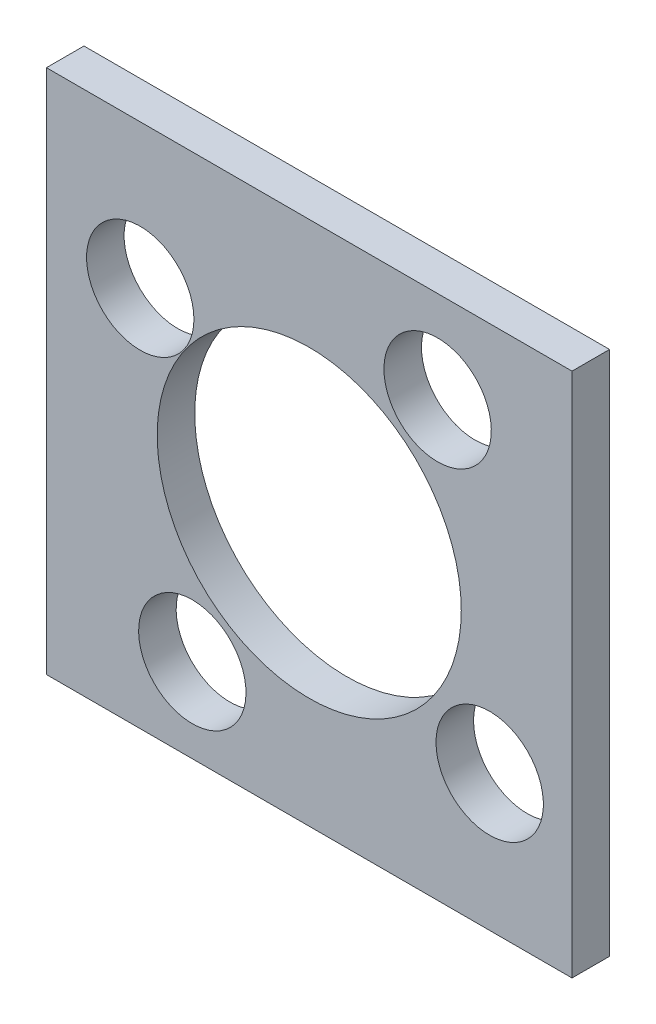
ISO-10303-21;
HEADER;
FILE_DESCRIPTION(('STEP AP214'),'2;1');
FILE_NAME('part.step','',(''),(''),'','','');
FILE_SCHEMA(('AUTOMOTIVE_DESIGN { 1 0 10303 214 1 1 1 1 }'));
ENDSEC;
DATA;
#1=APPLICATION_CONTEXT('core data for automotive mechanical design processes');
#2=APPLICATION_PROTOCOL_DEFINITION('international standard','automotive_design',2000,#1);
#3=PRODUCT_CONTEXT('',#1,'mechanical');
#4=PRODUCT('Part','Part','',(#3));
#5=PRODUCT_RELATED_PRODUCT_CATEGORY('part','',(#4));
#6=PRODUCT_DEFINITION_FORMATION('','',#4);
#7=PRODUCT_DEFINITION_CONTEXT('part definition',#1,'design');
#8=PRODUCT_DEFINITION('design','',#6,#7);
#9=PRODUCT_DEFINITION_SHAPE('','',#8);
#10=(LENGTH_UNIT() NAMED_UNIT(*) SI_UNIT(.MILLI.,.METRE.));
#11=(NAMED_UNIT(*) PLANE_ANGLE_UNIT() SI_UNIT($,.RADIAN.));
#12=(NAMED_UNIT(*) SI_UNIT($,.STERADIAN.) SOLID_ANGLE_UNIT());
#13=UNCERTAINTY_MEASURE_WITH_UNIT(LENGTH_MEASURE(1.E-05),#10,'distance_accuracy_value','');
#14=(GEOMETRIC_REPRESENTATION_CONTEXT(3) GLOBAL_UNCERTAINTY_ASSIGNED_CONTEXT((#13)) GLOBAL_UNIT_ASSIGNED_CONTEXT((#10,
#11,#12)) REPRESENTATION_CONTEXT('',''));
#15=CARTESIAN_POINT('',(0.,0.,0.));
#16=DIRECTION('',(0.,0.,1.));
#17=DIRECTION('',(1.,0.,0.));
#18=AXIS2_PLACEMENT_3D('',#15,#16,#17);
#19=CARTESIAN_POINT('',(70.,70.,10.));
#20=DIRECTION('',(-1.,0.,0.));
#21=DIRECTION('',(0.,-1.,0.));
#22=AXIS2_PLACEMENT_3D('',#19,#20,#21);
#23=PLANE('',#22);
#24=DIRECTION('',(0.,1.,0.));
#25=VECTOR('',#24,1.);
#26=CARTESIAN_POINT('',(70.,70.,0.));
#27=LINE('',#26,#25);
#28=CARTESIAN_POINT('',(70.,-70.,0.));
#29=VERTEX_POINT('',#28);
#30=CARTESIAN_POINT('',(70.,70.,0.));
#31=VERTEX_POINT('',#30);
#32=EDGE_CURVE('E113',#29,#31,#27,.T.);
#33=ORIENTED_EDGE('',*,*,#32,.T.);
#34=DIRECTION('',(0.,0.,-1.));
#35=VECTOR('',#34,1.);
#36=CARTESIAN_POINT('',(70.,70.,10.));
#37=LINE('',#36,#35);
#38=CARTESIAN_POINT('',(70.,70.,10.));
#39=VERTEX_POINT('',#38);
#40=EDGE_CURVE('E11',#39,#31,#37,.T.);
#41=ORIENTED_EDGE('',*,*,#40,.F.);
#42=DIRECTION('',(0.,1.,0.));
#43=VECTOR('',#42,1.);
#44=CARTESIAN_POINT('',(70.,70.,10.));
#45=LINE('',#44,#43);
#46=CARTESIAN_POINT('',(70.,-70.,10.));
#47=VERTEX_POINT('',#46);
#48=EDGE_CURVE('E97',#47,#39,#45,.T.);
#49=ORIENTED_EDGE('',*,*,#48,.F.);
#50=DIRECTION('',(0.,0.,-1.));
#51=VECTOR('',#50,1.);
#52=CARTESIAN_POINT('',(70.,-70.,10.));
#53=LINE('',#52,#51);
#54=EDGE_CURVE('E109',#47,#29,#53,.T.);
#55=ORIENTED_EDGE('',*,*,#54,.T.);
#56=EDGE_LOOP('',(#33,#41,#49,#55));
#57=FACE_BOUND('',#56,.T.);
#58=ADVANCED_FACE('F45',(#57),#23,.F.);
#59=CARTESIAN_POINT('',(-70.,70.,10.));
#60=DIRECTION('',(0.,-1.,0.));
#61=DIRECTION('',(0.,0.,-1.));
#62=AXIS2_PLACEMENT_3D('',#59,#60,#61);
#63=PLANE('',#62);
#64=DIRECTION('',(-1.,0.,0.));
#65=VECTOR('',#64,1.);
#66=CARTESIAN_POINT('',(-70.,70.,0.));
#67=LINE('',#66,#65);
#68=CARTESIAN_POINT('',(-70.,70.,0.));
#69=VERTEX_POINT('',#68);
#70=EDGE_CURVE('E102',#31,#69,#67,.T.);
#71=ORIENTED_EDGE('',*,*,#70,.T.);
#72=DIRECTION('',(0.,0.,-1.));
#73=VECTOR('',#72,1.);
#74=CARTESIAN_POINT('',(-70.,70.,10.));
#75=LINE('',#74,#73);
#76=CARTESIAN_POINT('',(-70.,70.,10.));
#77=VERTEX_POINT('',#76);
#78=EDGE_CURVE('E54',#77,#69,#75,.T.);
#79=ORIENTED_EDGE('',*,*,#78,.F.);
#80=DIRECTION('',(-1.,0.,0.));
#81=VECTOR('',#80,1.);
#82=CARTESIAN_POINT('',(-70.,70.,10.));
#83=LINE('',#82,#81);
#84=EDGE_CURVE('E92',#39,#77,#83,.T.);
#85=ORIENTED_EDGE('',*,*,#84,.F.);
#86=ORIENTED_EDGE('',*,*,#40,.T.);
#87=EDGE_LOOP('',(#71,#79,#85,#86));
#88=FACE_BOUND('',#87,.T.);
#89=ADVANCED_FACE('F101',(#88),#63,.F.);
#90=CARTESIAN_POINT('',(-70.,70.,10.));
#91=DIRECTION('',(1.,0.,0.));
#92=DIRECTION('',(0.,1.,0.));
#93=AXIS2_PLACEMENT_3D('',#90,#91,#92);
#94=PLANE('',#93);
#95=DIRECTION('',(0.,-1.,0.));
#96=VECTOR('',#95,1.);
#97=CARTESIAN_POINT('',(-70.,70.,0.));
#98=LINE('',#97,#96);
#99=CARTESIAN_POINT('',(-70.,-70.,0.));
#100=VERTEX_POINT('',#99);
#101=EDGE_CURVE('E79',#69,#100,#98,.T.);
#102=ORIENTED_EDGE('',*,*,#101,.T.);
#103=DIRECTION('',(0.,0.,-1.));
#104=VECTOR('',#103,1.);
#105=CARTESIAN_POINT('',(-70.,-70.,10.));
#106=LINE('',#105,#104);
#107=CARTESIAN_POINT('',(-70.,-70.,10.));
#108=VERTEX_POINT('',#107);
#109=EDGE_CURVE('E104',#108,#100,#106,.T.);
#110=ORIENTED_EDGE('',*,*,#109,.F.);
#111=DIRECTION('',(0.,-1.,0.));
#112=VECTOR('',#111,1.);
#113=CARTESIAN_POINT('',(-70.,70.,10.));
#114=LINE('',#113,#112);
#115=EDGE_CURVE('E95',#77,#108,#114,.T.);
#116=ORIENTED_EDGE('',*,*,#115,.F.);
#117=ORIENTED_EDGE('',*,*,#78,.T.);
#118=EDGE_LOOP('',(#102,#110,#116,#117));
#119=FACE_BOUND('',#118,.T.);
#120=ADVANCED_FACE('F105',(#119),#94,.F.);
#121=CARTESIAN_POINT('',(-70.,-70.,10.));
#122=DIRECTION('',(0.,1.,0.));
#123=DIRECTION('',(0.,0.,1.));
#124=AXIS2_PLACEMENT_3D('',#121,#122,#123);
#125=PLANE('',#124);
#126=DIRECTION('',(1.,0.,0.));
#127=VECTOR('',#126,1.);
#128=CARTESIAN_POINT('',(-70.,-70.,0.));
#129=LINE('',#128,#127);
#130=EDGE_CURVE('E85',#100,#29,#129,.T.);
#131=ORIENTED_EDGE('',*,*,#130,.T.);
#132=ORIENTED_EDGE('',*,*,#54,.F.);
#133=DIRECTION('',(1.,0.,0.));
#134=VECTOR('',#133,1.);
#135=CARTESIAN_POINT('',(-70.,-70.,10.));
#136=LINE('',#135,#134);
#137=EDGE_CURVE('E62',#108,#47,#136,.T.);
#138=ORIENTED_EDGE('',*,*,#137,.F.);
#139=ORIENTED_EDGE('',*,*,#109,.T.);
#140=EDGE_LOOP('',(#131,#132,#138,#139));
#141=FACE_BOUND('',#140,.T.);
#142=ADVANCED_FACE('F127',(#141),#125,.F.);
#143=CARTESIAN_POINT('',(0.,0.,10.));
#144=DIRECTION('',(0.,0.,1.));
#145=DIRECTION('',(1.,0.,0.));
#146=AXIS2_PLACEMENT_3D('',#143,#144,#145);
#147=PLANE('',#146);
#148=CARTESIAN_POINT('',(0.,0.,10.));
#149=DIRECTION('',(0.,0.,1.));
#150=DIRECTION('',(1.,0.,0.));
#151=AXIS2_PLACEMENT_3D('',#148,#149,#150);
#152=CIRCLE('',#151,40.5);
#153=CARTESIAN_POINT('',(40.5,0.,10.));
#154=VERTEX_POINT('',#153);
#155=EDGE_CURVE('E166',#154,#154,#152,.T.);
#156=ORIENTED_EDGE('',*,*,#155,.F.);
#157=EDGE_LOOP('',(#156));
#158=FACE_BOUND('',#157,.T.);
#159=CARTESIAN_POINT('',(-31.14529457582,-47.6123660636759,10.));
#160=DIRECTION('',(0.,0.,1.));
#161=DIRECTION('',(0.,1.,0.));
#162=AXIS2_PLACEMENT_3D('',#159,#160,#161);
#163=CIRCLE('',#162,14.3);
#164=CARTESIAN_POINT('',(-31.1452945758201,-33.3123660636759,10.));
#165=VERTEX_POINT('',#164);
#166=EDGE_CURVE('E159',#165,#165,#163,.T.);
#167=ORIENTED_EDGE('',*,*,#166,.F.);
#168=EDGE_LOOP('',(#167));
#169=FACE_BOUND('',#168,.T.);
#170=CARTESIAN_POINT('',(48.0670041508742,-33.7416162142836,10.));
#171=DIRECTION('',(0.,0.,1.));
#172=DIRECTION('',(-1.,0.,0.));
#173=AXIS2_PLACEMENT_3D('',#170,#171,#172);
#174=CIRCLE('',#173,14.3);
#175=CARTESIAN_POINT('',(33.7670041508742,-33.7416162142836,10.));
#176=VERTEX_POINT('',#175);
#177=EDGE_CURVE('E151',#176,#176,#174,.T.);
#178=ORIENTED_EDGE('',*,*,#177,.F.);
#179=EDGE_LOOP('',(#178));
#180=FACE_BOUND('',#179,.T.);
#181=CARTESIAN_POINT('',(34.1962543014815,45.4706825124111,10.));
#182=DIRECTION('',(0.,0.,1.));
#183=DIRECTION('',(0.,-1.,0.));
#184=AXIS2_PLACEMENT_3D('',#181,#182,#183);
#185=CIRCLE('',#184,14.3);
#186=CARTESIAN_POINT('',(34.1962543014817,31.1706825124111,10.));
#187=VERTEX_POINT('',#186);
#188=EDGE_CURVE('E142',#187,#187,#185,.T.);
#189=ORIENTED_EDGE('',*,*,#188,.F.);
#190=EDGE_LOOP('',(#189));
#191=FACE_BOUND('',#190,.T.);
#192=CARTESIAN_POINT('',(-45.0160444252124,31.5999326630186,10.));
#193=DIRECTION('',(0.,0.,1.));
#194=DIRECTION('',(1.,0.,0.));
#195=AXIS2_PLACEMENT_3D('',#192,#193,#194);
#196=CIRCLE('',#195,14.3);
#197=CARTESIAN_POINT('',(-30.7160444252124,31.5999326630186,10.));
#198=VERTEX_POINT('',#197);
#199=EDGE_CURVE('E134',#198,#198,#196,.T.);
#200=ORIENTED_EDGE('',*,*,#199,.F.);
#201=EDGE_LOOP('',(#200));
#202=FACE_BOUND('',#201,.T.);
#203=ORIENTED_EDGE('',*,*,#48,.T.);
#204=ORIENTED_EDGE('',*,*,#84,.T.);
#205=ORIENTED_EDGE('',*,*,#115,.T.);
#206=ORIENTED_EDGE('',*,*,#137,.T.);
#207=EDGE_LOOP('',(#203,#204,#205,#206));
#208=FACE_BOUND('',#207,.T.);
#209=ADVANCED_FACE('F93',(#158,#169,#180,#191,#202,#208),#147,.T.);
#210=CARTESIAN_POINT('',(0.,0.,0.));
#211=DIRECTION('',(0.,0.,1.));
#212=DIRECTION('',(1.,0.,0.));
#213=AXIS2_PLACEMENT_3D('',#210,#211,#212);
#214=PLANE('',#213);
#215=CARTESIAN_POINT('',(0.,0.,0.));
#216=DIRECTION('',(0.,0.,1.));
#217=DIRECTION('',(1.,0.,0.));
#218=AXIS2_PLACEMENT_3D('',#215,#216,#217);
#219=CIRCLE('',#218,40.5);
#220=CARTESIAN_POINT('',(40.5,0.,0.));
#221=VERTEX_POINT('',#220);
#222=EDGE_CURVE('E147',#221,#221,#219,.T.);
#223=ORIENTED_EDGE('',*,*,#222,.T.);
#224=EDGE_LOOP('',(#223));
#225=FACE_BOUND('',#224,.T.);
#226=CARTESIAN_POINT('',(-31.14529457582,-47.6123660636759,0.));
#227=DIRECTION('',(0.,0.,1.));
#228=DIRECTION('',(0.,1.,0.));
#229=AXIS2_PLACEMENT_3D('',#226,#227,#228);
#230=CIRCLE('',#229,14.3);
#231=CARTESIAN_POINT('',(-31.1452945758201,-33.3123660636759,0.));
#232=VERTEX_POINT('',#231);
#233=EDGE_CURVE('E138',#232,#232,#230,.T.);
#234=ORIENTED_EDGE('',*,*,#233,.T.);
#235=EDGE_LOOP('',(#234));
#236=FACE_BOUND('',#235,.T.);
#237=CARTESIAN_POINT('',(48.0670041508742,-33.7416162142836,0.));
#238=DIRECTION('',(0.,0.,1.));
#239=DIRECTION('',(-1.,0.,0.));
#240=AXIS2_PLACEMENT_3D('',#237,#238,#239);
#241=CIRCLE('',#240,14.3);
#242=CARTESIAN_POINT('',(33.7670041508742,-33.7416162142836,0.));
#243=VERTEX_POINT('',#242);
#244=EDGE_CURVE('E155',#243,#243,#241,.T.);
#245=ORIENTED_EDGE('',*,*,#244,.T.);
#246=EDGE_LOOP('',(#245));
#247=FACE_BOUND('',#246,.T.);
#248=CARTESIAN_POINT('',(34.1962543014815,45.4706825124111,0.));
#249=DIRECTION('',(0.,0.,1.));
#250=DIRECTION('',(0.,-1.,0.));
#251=AXIS2_PLACEMENT_3D('',#248,#249,#250);
#252=CIRCLE('',#251,14.3);
#253=CARTESIAN_POINT('',(34.1962543014817,31.1706825124111,0.));
#254=VERTEX_POINT('',#253);
#255=EDGE_CURVE('E146',#254,#254,#252,.T.);
#256=ORIENTED_EDGE('',*,*,#255,.T.);
#257=EDGE_LOOP('',(#256));
#258=FACE_BOUND('',#257,.T.);
#259=CARTESIAN_POINT('',(-45.0160444252124,31.5999326630186,0.));
#260=DIRECTION('',(0.,0.,1.));
#261=DIRECTION('',(1.,0.,0.));
#262=AXIS2_PLACEMENT_3D('',#259,#260,#261);
#263=CIRCLE('',#262,14.3);
#264=CARTESIAN_POINT('',(-30.7160444252124,31.5999326630186,0.));
#265=VERTEX_POINT('',#264);
#266=EDGE_CURVE('E117',#265,#265,#263,.T.);
#267=ORIENTED_EDGE('',*,*,#266,.T.);
#268=EDGE_LOOP('',(#267));
#269=FACE_BOUND('',#268,.T.);
#270=ORIENTED_EDGE('',*,*,#32,.F.);
#271=ORIENTED_EDGE('',*,*,#130,.F.);
#272=ORIENTED_EDGE('',*,*,#101,.F.);
#273=ORIENTED_EDGE('',*,*,#70,.F.);
#274=EDGE_LOOP('',(#270,#271,#272,#273));
#275=FACE_BOUND('',#274,.T.);
#276=ADVANCED_FACE('F130',(#225,#236,#247,#258,#269,#275),#214,.F.);
#277=CARTESIAN_POINT('',(-45.0160444252124,31.5999326630186,0.));
#278=DIRECTION('',(0.,0.,1.));
#279=DIRECTION('',(1.,0.,0.));
#280=AXIS2_PLACEMENT_3D('',#277,#278,#279);
#281=CYLINDRICAL_SURFACE('',#280,14.3);
#282=ORIENTED_EDGE('',*,*,#266,.F.);
#283=EDGE_LOOP('',(#282));
#284=FACE_BOUND('',#283,.T.);
#285=ORIENTED_EDGE('',*,*,#199,.T.);
#286=EDGE_LOOP('',(#285));
#287=FACE_BOUND('',#286,.T.);
#288=ADVANCED_FACE('F194',(#284,#287),#281,.F.);
#289=CARTESIAN_POINT('',(34.1962543014815,45.4706825124111,0.));
#290=DIRECTION('',(0.,0.,1.));
#291=DIRECTION('',(1.,0.,0.));
#292=AXIS2_PLACEMENT_3D('',#289,#290,#291);
#293=CYLINDRICAL_SURFACE('',#292,14.3);
#294=ORIENTED_EDGE('',*,*,#255,.F.);
#295=EDGE_LOOP('',(#294));
#296=FACE_BOUND('',#295,.T.);
#297=ORIENTED_EDGE('',*,*,#188,.T.);
#298=EDGE_LOOP('',(#297));
#299=FACE_BOUND('',#298,.T.);
#300=ADVANCED_FACE('F196',(#296,#299),#293,.F.);
#301=CARTESIAN_POINT('',(48.0670041508742,-33.7416162142836,0.));
#302=DIRECTION('',(0.,0.,1.));
#303=DIRECTION('',(1.,0.,0.));
#304=AXIS2_PLACEMENT_3D('',#301,#302,#303);
#305=CYLINDRICAL_SURFACE('',#304,14.3);
#306=ORIENTED_EDGE('',*,*,#244,.F.);
#307=EDGE_LOOP('',(#306));
#308=FACE_BOUND('',#307,.T.);
#309=ORIENTED_EDGE('',*,*,#177,.T.);
#310=EDGE_LOOP('',(#309));
#311=FACE_BOUND('',#310,.T.);
#312=ADVANCED_FACE('F203',(#308,#311),#305,.F.);
#313=CARTESIAN_POINT('',(-31.14529457582,-47.6123660636759,0.));
#314=DIRECTION('',(0.,0.,1.));
#315=DIRECTION('',(1.,0.,0.));
#316=AXIS2_PLACEMENT_3D('',#313,#314,#315);
#317=CYLINDRICAL_SURFACE('',#316,14.3);
#318=ORIENTED_EDGE('',*,*,#233,.F.);
#319=EDGE_LOOP('',(#318));
#320=FACE_BOUND('',#319,.T.);
#321=ORIENTED_EDGE('',*,*,#166,.T.);
#322=EDGE_LOOP('',(#321));
#323=FACE_BOUND('',#322,.T.);
#324=ADVANCED_FACE('F179',(#320,#323),#317,.F.);
#325=CARTESIAN_POINT('',(0.,0.,0.));
#326=DIRECTION('',(0.,0.,1.));
#327=DIRECTION('',(1.,0.,0.));
#328=AXIS2_PLACEMENT_3D('',#325,#326,#327);
#329=CYLINDRICAL_SURFACE('',#328,40.5);
#330=ORIENTED_EDGE('',*,*,#222,.F.);
#331=EDGE_LOOP('',(#330));
#332=FACE_BOUND('',#331,.T.);
#333=ORIENTED_EDGE('',*,*,#155,.T.);
#334=EDGE_LOOP('',(#333));
#335=FACE_BOUND('',#334,.T.);
#336=ADVANCED_FACE('F176',(#332,#335),#329,.F.);
#337=CLOSED_SHELL('',(#58,#89,#120,#142,#209,#276,#288,#300,#312,#324,#336));
#338=MANIFOLD_SOLID_BREP('B2',#337);
#339=ADVANCED_BREP_SHAPE_REPRESENTATION('',(#18,#338),#14);
#340=SHAPE_DEFINITION_REPRESENTATION(#9,#339);
ENDSEC;
END-ISO-10303-21;
